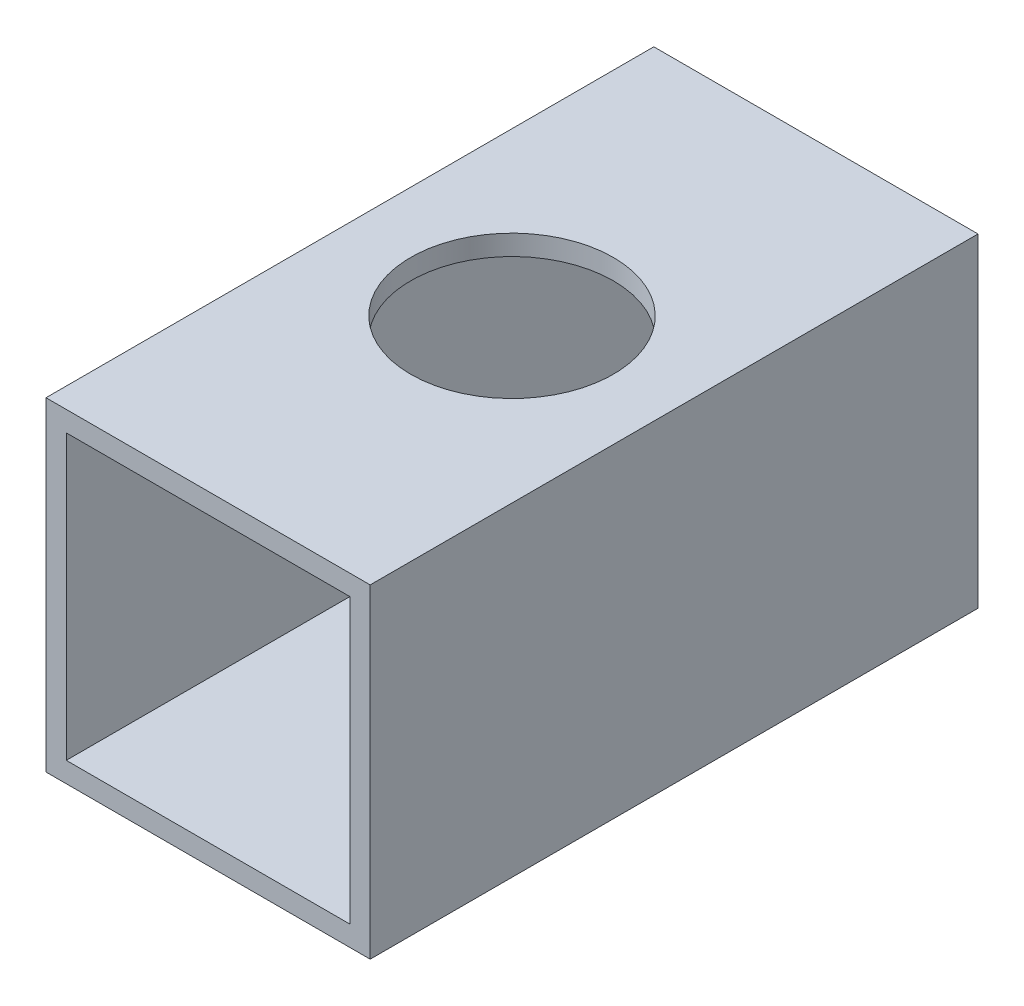
ISO-10303-21;
HEADER;
FILE_DESCRIPTION(('STEP AP214'),'2;1');
FILE_NAME('part.step','',(''),(''),'','','');
FILE_SCHEMA(('AUTOMOTIVE_DESIGN { 1 0 10303 214 1 1 1 1 }'));
ENDSEC;
DATA;
#1=APPLICATION_CONTEXT('core data for automotive mechanical design processes');
#2=APPLICATION_PROTOCOL_DEFINITION('international standard','automotive_design',2000,#1);
#3=PRODUCT_CONTEXT('',#1,'mechanical');
#4=PRODUCT('Part','Part','',(#3));
#5=PRODUCT_RELATED_PRODUCT_CATEGORY('part','',(#4));
#6=PRODUCT_DEFINITION_FORMATION('','',#4);
#7=PRODUCT_DEFINITION_CONTEXT('part definition',#1,'design');
#8=PRODUCT_DEFINITION('design','',#6,#7);
#9=PRODUCT_DEFINITION_SHAPE('','',#8);
#10=(LENGTH_UNIT() NAMED_UNIT(*) SI_UNIT(.MILLI.,.METRE.));
#11=(NAMED_UNIT(*) PLANE_ANGLE_UNIT() SI_UNIT($,.RADIAN.));
#12=(NAMED_UNIT(*) SI_UNIT($,.STERADIAN.) SOLID_ANGLE_UNIT());
#13=UNCERTAINTY_MEASURE_WITH_UNIT(LENGTH_MEASURE(1.E-05),#10,'distance_accuracy_value','');
#14=(GEOMETRIC_REPRESENTATION_CONTEXT(3) GLOBAL_UNCERTAINTY_ASSIGNED_CONTEXT((#13)) GLOBAL_UNIT_ASSIGNED_CONTEXT((#10,
#11,#12)) REPRESENTATION_CONTEXT('',''));
#15=CARTESIAN_POINT('',(0.,0.,0.));
#16=DIRECTION('',(0.,0.,1.));
#17=DIRECTION('',(1.,0.,0.));
#18=AXIS2_PLACEMENT_3D('',#15,#16,#17);
#19=CARTESIAN_POINT('',(0.,0.,15.));
#20=DIRECTION('',(0.,0.,-1.));
#21=DIRECTION('',(-1.,0.,0.));
#22=AXIS2_PLACEMENT_3D('',#19,#20,#21);
#23=PLANE('',#22);
#24=DIRECTION('',(0.,-1.,0.));
#25=VECTOR('',#24,1.);
#26=CARTESIAN_POINT('',(-7.99999999999999,-8.,15.));
#27=LINE('',#26,#25);
#28=CARTESIAN_POINT('',(-7.99999999999999,8.,15.));
#29=VERTEX_POINT('',#28);
#30=CARTESIAN_POINT('',(-7.99999999999999,-8.,15.));
#31=VERTEX_POINT('',#30);
#32=EDGE_CURVE('E138',#29,#31,#27,.T.);
#33=ORIENTED_EDGE('',*,*,#32,.T.);
#34=DIRECTION('',(1.,0.,0.));
#35=VECTOR('',#34,1.);
#36=CARTESIAN_POINT('',(-7.99999999999999,-8.,15.));
#37=LINE('',#36,#35);
#38=CARTESIAN_POINT('',(8.,-8.,15.));
#39=VERTEX_POINT('',#38);
#40=EDGE_CURVE('E141',#31,#39,#37,.T.);
#41=ORIENTED_EDGE('',*,*,#40,.T.);
#42=DIRECTION('',(0.,1.,0.));
#43=VECTOR('',#42,1.);
#44=CARTESIAN_POINT('',(8.,-8.,15.));
#45=LINE('',#44,#43);
#46=CARTESIAN_POINT('',(8.00000000000001,8.,15.));
#47=VERTEX_POINT('',#46);
#48=EDGE_CURVE('E144',#39,#47,#45,.T.);
#49=ORIENTED_EDGE('',*,*,#48,.T.);
#50=DIRECTION('',(-1.,0.,0.));
#51=VECTOR('',#50,1.);
#52=CARTESIAN_POINT('',(-7.99999999999999,8.,15.));
#53=LINE('',#52,#51);
#54=EDGE_CURVE('E146',#47,#29,#53,.T.);
#55=ORIENTED_EDGE('',*,*,#54,.T.);
#56=EDGE_LOOP('',(#33,#41,#49,#55));
#57=FACE_BOUND('',#56,.T.);
#58=DIRECTION('',(0.,1.,0.));
#59=VECTOR('',#58,1.);
#60=CARTESIAN_POINT('',(7.00000000000001,-7.,15.));
#61=LINE('',#60,#59);
#62=CARTESIAN_POINT('',(7.00000000000001,-7.,15.));
#63=VERTEX_POINT('',#62);
#64=CARTESIAN_POINT('',(7.00000000000001,7.,15.));
#65=VERTEX_POINT('',#64);
#66=EDGE_CURVE('E100',#63,#65,#61,.T.);
#67=ORIENTED_EDGE('',*,*,#66,.F.);
#68=DIRECTION('',(1.,0.,0.));
#69=VECTOR('',#68,1.);
#70=CARTESIAN_POINT('',(-6.99999999999999,-7.,15.));
#71=LINE('',#70,#69);
#72=CARTESIAN_POINT('',(-6.99999999999999,-7.,15.));
#73=VERTEX_POINT('',#72);
#74=EDGE_CURVE('E122',#73,#63,#71,.T.);
#75=ORIENTED_EDGE('',*,*,#74,.F.);
#76=DIRECTION('',(0.,-1.,0.));
#77=VECTOR('',#76,1.);
#78=CARTESIAN_POINT('',(-6.99999999999999,-7.,15.));
#79=LINE('',#78,#77);
#80=CARTESIAN_POINT('',(-6.99999999999999,7.,15.));
#81=VERTEX_POINT('',#80);
#82=EDGE_CURVE('E120',#81,#73,#79,.T.);
#83=ORIENTED_EDGE('',*,*,#82,.F.);
#84=DIRECTION('',(-1.,0.,0.));
#85=VECTOR('',#84,1.);
#86=CARTESIAN_POINT('',(-6.99999999999999,7.,15.));
#87=LINE('',#86,#85);
#88=EDGE_CURVE('E108',#65,#81,#87,.T.);
#89=ORIENTED_EDGE('',*,*,#88,.F.);
#90=EDGE_LOOP('',(#67,#75,#83,#89));
#91=FACE_BOUND('',#90,.T.);
#92=ADVANCED_FACE('F33',(#57,#91),#23,.F.);
#93=CARTESIAN_POINT('',(0.,0.,-15.));
#94=DIRECTION('',(0.,0.,-1.));
#95=DIRECTION('',(-1.,0.,0.));
#96=AXIS2_PLACEMENT_3D('',#93,#94,#95);
#97=PLANE('',#96);
#98=DIRECTION('',(0.,-1.,0.));
#99=VECTOR('',#98,1.);
#100=CARTESIAN_POINT('',(-7.99999999999999,-8.,-15.));
#101=LINE('',#100,#99);
#102=CARTESIAN_POINT('',(-7.99999999999999,8.,-15.));
#103=VERTEX_POINT('',#102);
#104=CARTESIAN_POINT('',(-7.99999999999999,-8.,-15.));
#105=VERTEX_POINT('',#104);
#106=EDGE_CURVE('E116',#103,#105,#101,.T.);
#107=ORIENTED_EDGE('',*,*,#106,.F.);
#108=DIRECTION('',(-1.,0.,0.));
#109=VECTOR('',#108,1.);
#110=CARTESIAN_POINT('',(-7.99999999999999,8.,-15.));
#111=LINE('',#110,#109);
#112=CARTESIAN_POINT('',(8.00000000000001,8.,-15.));
#113=VERTEX_POINT('',#112);
#114=EDGE_CURVE('E142',#113,#103,#111,.T.);
#115=ORIENTED_EDGE('',*,*,#114,.F.);
#116=DIRECTION('',(0.,1.,0.));
#117=VECTOR('',#116,1.);
#118=CARTESIAN_POINT('',(8.,-8.,-15.));
#119=LINE('',#118,#117);
#120=CARTESIAN_POINT('',(8.,-8.,-15.));
#121=VERTEX_POINT('',#120);
#122=EDGE_CURVE('E153',#121,#113,#119,.T.);
#123=ORIENTED_EDGE('',*,*,#122,.F.);
#124=DIRECTION('',(1.,0.,0.));
#125=VECTOR('',#124,1.);
#126=CARTESIAN_POINT('',(-7.99999999999999,-8.,-15.));
#127=LINE('',#126,#125);
#128=EDGE_CURVE('E151',#105,#121,#127,.T.);
#129=ORIENTED_EDGE('',*,*,#128,.F.);
#130=EDGE_LOOP('',(#107,#115,#123,#129));
#131=FACE_BOUND('',#130,.T.);
#132=DIRECTION('',(1.,0.,0.));
#133=VECTOR('',#132,1.);
#134=CARTESIAN_POINT('',(-6.99999999999999,-7.,-15.));
#135=LINE('',#134,#133);
#136=CARTESIAN_POINT('',(-6.99999999999999,-7.,-15.));
#137=VERTEX_POINT('',#136);
#138=CARTESIAN_POINT('',(7.00000000000001,-7.,-15.));
#139=VERTEX_POINT('',#138);
#140=EDGE_CURVE('E109',#137,#139,#135,.T.);
#141=ORIENTED_EDGE('',*,*,#140,.T.);
#142=DIRECTION('',(0.,1.,0.));
#143=VECTOR('',#142,1.);
#144=CARTESIAN_POINT('',(7.00000000000001,-7.,-15.));
#145=LINE('',#144,#143);
#146=CARTESIAN_POINT('',(7.00000000000001,7.,-15.));
#147=VERTEX_POINT('',#146);
#148=EDGE_CURVE('E58',#139,#147,#145,.T.);
#149=ORIENTED_EDGE('',*,*,#148,.T.);
#150=DIRECTION('',(-1.,0.,0.));
#151=VECTOR('',#150,1.);
#152=CARTESIAN_POINT('',(-6.99999999999999,7.,-15.));
#153=LINE('',#152,#151);
#154=CARTESIAN_POINT('',(-6.99999999999999,7.,-15.));
#155=VERTEX_POINT('',#154);
#156=EDGE_CURVE('E115',#147,#155,#153,.T.);
#157=ORIENTED_EDGE('',*,*,#156,.T.);
#158=DIRECTION('',(0.,-1.,0.));
#159=VECTOR('',#158,1.);
#160=CARTESIAN_POINT('',(-6.99999999999999,-7.,-15.));
#161=LINE('',#160,#159);
#162=EDGE_CURVE('E130',#155,#137,#161,.T.);
#163=ORIENTED_EDGE('',*,*,#162,.T.);
#164=EDGE_LOOP('',(#141,#149,#157,#163));
#165=FACE_BOUND('',#164,.T.);
#166=ADVANCED_FACE('F192',(#131,#165),#97,.T.);
#167=CARTESIAN_POINT('',(-7.99999999999999,-8.,15.));
#168=DIRECTION('',(1.,0.,0.));
#169=DIRECTION('',(0.,0.,-1.));
#170=AXIS2_PLACEMENT_3D('',#167,#168,#169);
#171=PLANE('',#170);
#172=ORIENTED_EDGE('',*,*,#106,.T.);
#173=DIRECTION('',(0.,0.,-1.));
#174=VECTOR('',#173,1.);
#175=CARTESIAN_POINT('',(-7.99999999999999,-8.,15.));
#176=LINE('',#175,#174);
#177=EDGE_CURVE('E11',#31,#105,#176,.T.);
#178=ORIENTED_EDGE('',*,*,#177,.F.);
#179=ORIENTED_EDGE('',*,*,#32,.F.);
#180=DIRECTION('',(0.,0.,-1.));
#181=VECTOR('',#180,1.);
#182=CARTESIAN_POINT('',(-7.99999999999999,8.,15.));
#183=LINE('',#182,#181);
#184=EDGE_CURVE('E148',#29,#103,#183,.T.);
#185=ORIENTED_EDGE('',*,*,#184,.T.);
#186=EDGE_LOOP('',(#172,#178,#179,#185));
#187=FACE_BOUND('',#186,.T.);
#188=ADVANCED_FACE('F35',(#187),#171,.F.);
#189=CARTESIAN_POINT('',(-7.99999999999999,-8.,15.));
#190=DIRECTION('',(0.,1.,0.));
#191=DIRECTION('',(0.,0.,1.));
#192=AXIS2_PLACEMENT_3D('',#189,#190,#191);
#193=PLANE('',#192);
#194=CARTESIAN_POINT('',(0.,-8.,0.));
#195=DIRECTION('',(0.,1.,0.));
#196=DIRECTION('',(0.,0.,1.));
#197=AXIS2_PLACEMENT_3D('',#194,#195,#196);
#198=CIRCLE('',#197,2.5);
#199=CARTESIAN_POINT('',(0.,-8.,2.5));
#200=VERTEX_POINT('',#199);
#201=EDGE_CURVE('E128',#200,#200,#198,.T.);
#202=ORIENTED_EDGE('',*,*,#201,.T.);
#203=EDGE_LOOP('',(#202));
#204=FACE_BOUND('',#203,.T.);
#205=ORIENTED_EDGE('',*,*,#128,.T.);
#206=DIRECTION('',(0.,0.,-1.));
#207=VECTOR('',#206,1.);
#208=CARTESIAN_POINT('',(8.,-8.,15.));
#209=LINE('',#208,#207);
#210=EDGE_CURVE('E42',#39,#121,#209,.T.);
#211=ORIENTED_EDGE('',*,*,#210,.F.);
#212=ORIENTED_EDGE('',*,*,#40,.F.);
#213=ORIENTED_EDGE('',*,*,#177,.T.);
#214=EDGE_LOOP('',(#205,#211,#212,#213));
#215=FACE_BOUND('',#214,.T.);
#216=ADVANCED_FACE('F196',(#204,#215),#193,.F.);
#217=CARTESIAN_POINT('',(8.,-8.,15.));
#218=DIRECTION('',(-1.,0.,0.));
#219=DIRECTION('',(0.,-1.,0.));
#220=AXIS2_PLACEMENT_3D('',#217,#218,#219);
#221=PLANE('',#220);
#222=ORIENTED_EDGE('',*,*,#122,.T.);
#223=DIRECTION('',(0.,0.,-1.));
#224=VECTOR('',#223,1.);
#225=CARTESIAN_POINT('',(8.00000000000001,8.,15.));
#226=LINE('',#225,#224);
#227=EDGE_CURVE('E158',#47,#113,#226,.T.);
#228=ORIENTED_EDGE('',*,*,#227,.F.);
#229=ORIENTED_EDGE('',*,*,#48,.F.);
#230=ORIENTED_EDGE('',*,*,#210,.T.);
#231=EDGE_LOOP('',(#222,#228,#229,#230));
#232=FACE_BOUND('',#231,.T.);
#233=ADVANCED_FACE('F180',(#232),#221,.F.);
#234=CARTESIAN_POINT('',(-7.99999999999999,8.,15.));
#235=DIRECTION('',(0.,-1.,0.));
#236=DIRECTION('',(0.,0.,-1.));
#237=AXIS2_PLACEMENT_3D('',#234,#235,#236);
#238=PLANE('',#237);
#239=CARTESIAN_POINT('',(0.,8.,0.));
#240=DIRECTION('',(0.,1.,0.));
#241=DIRECTION('',(0.,0.,1.));
#242=AXIS2_PLACEMENT_3D('',#239,#240,#241);
#243=CIRCLE('',#242,5.);
#244=CARTESIAN_POINT('',(0.,8.,5.));
#245=VERTEX_POINT('',#244);
#246=EDGE_CURVE('E168',#245,#245,#243,.T.);
#247=ORIENTED_EDGE('',*,*,#246,.F.);
#248=EDGE_LOOP('',(#247));
#249=FACE_BOUND('',#248,.T.);
#250=ORIENTED_EDGE('',*,*,#114,.T.);
#251=ORIENTED_EDGE('',*,*,#184,.F.);
#252=ORIENTED_EDGE('',*,*,#54,.F.);
#253=ORIENTED_EDGE('',*,*,#227,.T.);
#254=EDGE_LOOP('',(#250,#251,#252,#253));
#255=FACE_BOUND('',#254,.T.);
#256=ADVANCED_FACE('F177',(#249,#255),#238,.F.);
#257=CARTESIAN_POINT('',(7.00000000000001,-7.,15.));
#258=DIRECTION('',(-1.,0.,0.));
#259=DIRECTION('',(0.,0.,1.));
#260=AXIS2_PLACEMENT_3D('',#257,#258,#259);
#261=PLANE('',#260);
#262=ORIENTED_EDGE('',*,*,#148,.F.);
#263=DIRECTION('',(0.,0.,-1.));
#264=VECTOR('',#263,1.);
#265=CARTESIAN_POINT('',(7.00000000000001,-7.,15.));
#266=LINE('',#265,#264);
#267=EDGE_CURVE('E104',#63,#139,#266,.T.);
#268=ORIENTED_EDGE('',*,*,#267,.F.);
#269=ORIENTED_EDGE('',*,*,#66,.T.);
#270=DIRECTION('',(0.,0.,-1.));
#271=VECTOR('',#270,1.);
#272=CARTESIAN_POINT('',(7.00000000000001,7.,15.));
#273=LINE('',#272,#271);
#274=EDGE_CURVE('E103',#65,#147,#273,.T.);
#275=ORIENTED_EDGE('',*,*,#274,.T.);
#276=EDGE_LOOP('',(#262,#268,#269,#275));
#277=FACE_BOUND('',#276,.T.);
#278=ADVANCED_FACE('F102',(#277),#261,.T.);
#279=CARTESIAN_POINT('',(-6.99999999999999,7.,15.));
#280=DIRECTION('',(0.,-1.,0.));
#281=DIRECTION('',(0.,0.,-1.));
#282=AXIS2_PLACEMENT_3D('',#279,#280,#281);
#283=PLANE('',#282);
#284=CARTESIAN_POINT('',(0.,7.,0.));
#285=DIRECTION('',(0.,-1.,0.));
#286=DIRECTION('',(0.,0.,-1.));
#287=AXIS2_PLACEMENT_3D('',#284,#285,#286);
#288=CIRCLE('',#287,5.);
#289=CARTESIAN_POINT('',(0.,7.,-5.));
#290=VERTEX_POINT('',#289);
#291=EDGE_CURVE('E37',#290,#290,#288,.T.);
#292=ORIENTED_EDGE('',*,*,#291,.F.);
#293=EDGE_LOOP('',(#292));
#294=FACE_BOUND('',#293,.T.);
#295=ORIENTED_EDGE('',*,*,#156,.F.);
#296=ORIENTED_EDGE('',*,*,#274,.F.);
#297=ORIENTED_EDGE('',*,*,#88,.T.);
#298=DIRECTION('',(0.,0.,-1.));
#299=VECTOR('',#298,1.);
#300=CARTESIAN_POINT('',(-6.99999999999999,7.,15.));
#301=LINE('',#300,#299);
#302=EDGE_CURVE('E117',#81,#155,#301,.T.);
#303=ORIENTED_EDGE('',*,*,#302,.T.);
#304=EDGE_LOOP('',(#295,#296,#297,#303));
#305=FACE_BOUND('',#304,.T.);
#306=ADVANCED_FACE('F112',(#294,#305),#283,.T.);
#307=CARTESIAN_POINT('',(-6.99999999999999,-7.,15.));
#308=DIRECTION('',(1.,0.,0.));
#309=DIRECTION('',(0.,0.,-1.));
#310=AXIS2_PLACEMENT_3D('',#307,#308,#309);
#311=PLANE('',#310);
#312=ORIENTED_EDGE('',*,*,#162,.F.);
#313=ORIENTED_EDGE('',*,*,#302,.F.);
#314=ORIENTED_EDGE('',*,*,#82,.T.);
#315=DIRECTION('',(0.,0.,-1.));
#316=VECTOR('',#315,1.);
#317=CARTESIAN_POINT('',(-6.99999999999999,-7.,15.));
#318=LINE('',#317,#316);
#319=EDGE_CURVE('E50',#73,#137,#318,.T.);
#320=ORIENTED_EDGE('',*,*,#319,.T.);
#321=EDGE_LOOP('',(#312,#313,#314,#320));
#322=FACE_BOUND('',#321,.T.);
#323=ADVANCED_FACE('F217',(#322),#311,.T.);
#324=CARTESIAN_POINT('',(-6.99999999999999,-7.,15.));
#325=DIRECTION('',(0.,1.,0.));
#326=DIRECTION('',(0.,0.,1.));
#327=AXIS2_PLACEMENT_3D('',#324,#325,#326);
#328=PLANE('',#327);
#329=CARTESIAN_POINT('',(0.,-7.,0.));
#330=DIRECTION('',(0.,1.,0.));
#331=DIRECTION('',(0.,0.,1.));
#332=AXIS2_PLACEMENT_3D('',#329,#330,#331);
#333=CIRCLE('',#332,2.5);
#334=CARTESIAN_POINT('',(0.,-7.,2.5));
#335=VERTEX_POINT('',#334);
#336=EDGE_CURVE('E162',#335,#335,#333,.T.);
#337=ORIENTED_EDGE('',*,*,#336,.F.);
#338=EDGE_LOOP('',(#337));
#339=FACE_BOUND('',#338,.T.);
#340=ORIENTED_EDGE('',*,*,#140,.F.);
#341=ORIENTED_EDGE('',*,*,#319,.F.);
#342=ORIENTED_EDGE('',*,*,#74,.T.);
#343=ORIENTED_EDGE('',*,*,#267,.T.);
#344=EDGE_LOOP('',(#340,#341,#342,#343));
#345=FACE_BOUND('',#344,.T.);
#346=ADVANCED_FACE('F221',(#339,#345),#328,.T.);
#347=CARTESIAN_POINT('',(0.,-22.,0.));
#348=DIRECTION('',(0.,1.,0.));
#349=DIRECTION('',(0.,0.,1.));
#350=AXIS2_PLACEMENT_3D('',#347,#348,#349);
#351=CYLINDRICAL_SURFACE('',#350,2.5);
#352=ORIENTED_EDGE('',*,*,#336,.T.);
#353=EDGE_LOOP('',(#352));
#354=FACE_BOUND('',#353,.T.);
#355=ORIENTED_EDGE('',*,*,#201,.F.);
#356=EDGE_LOOP('',(#355));
#357=FACE_BOUND('',#356,.T.);
#358=ADVANCED_FACE('F225',(#354,#357),#351,.F.);
#359=CARTESIAN_POINT('',(0.,3.,0.));
#360=DIRECTION('',(0.,1.,0.));
#361=DIRECTION('',(0.,0.,1.));
#362=AXIS2_PLACEMENT_3D('',#359,#360,#361);
#363=CYLINDRICAL_SURFACE('',#362,5.);
#364=ORIENTED_EDGE('',*,*,#291,.T.);
#365=EDGE_LOOP('',(#364));
#366=FACE_BOUND('',#365,.T.);
#367=ORIENTED_EDGE('',*,*,#246,.T.);
#368=EDGE_LOOP('',(#367));
#369=FACE_BOUND('',#368,.T.);
#370=ADVANCED_FACE('F175',(#366,#369),#363,.F.);
#371=CLOSED_SHELL('',(#92,#166,#188,#216,#233,#256,#278,#306,#323,#346,#358,#370));
#372=MANIFOLD_SOLID_BREP('B2',#371);
#373=ADVANCED_BREP_SHAPE_REPRESENTATION('',(#18,#372),#14);
#374=SHAPE_DEFINITION_REPRESENTATION(#9,#373);
ENDSEC;
END-ISO-10303-21;
